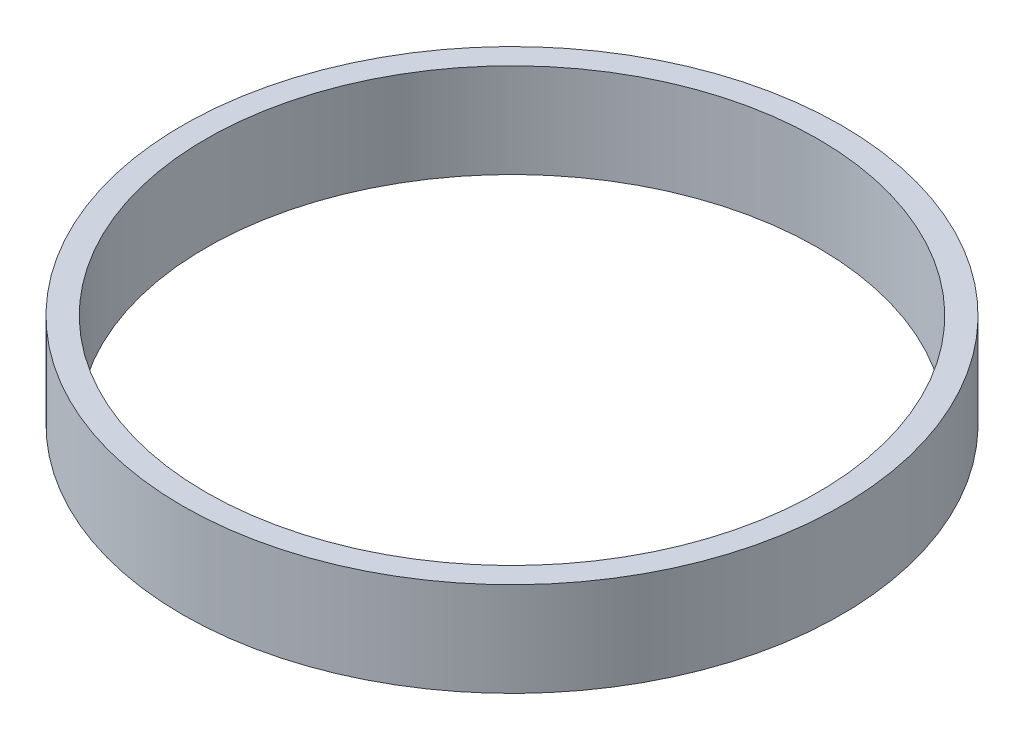
ISO-10303-21;
HEADER;
FILE_DESCRIPTION(('STEP AP214'),'2;1');
FILE_NAME('part.step','',(''),(''),'','','');
FILE_SCHEMA(('AUTOMOTIVE_DESIGN { 1 0 10303 214 1 1 1 1 }'));
ENDSEC;
DATA;
#1=APPLICATION_CONTEXT('core data for automotive mechanical design processes');
#2=APPLICATION_PROTOCOL_DEFINITION('international standard','automotive_design',2000,#1);
#3=PRODUCT_CONTEXT('',#1,'mechanical');
#4=PRODUCT('Part','Part','',(#3));
#5=PRODUCT_RELATED_PRODUCT_CATEGORY('part','',(#4));
#6=PRODUCT_DEFINITION_FORMATION('','',#4);
#7=PRODUCT_DEFINITION_CONTEXT('part definition',#1,'design');
#8=PRODUCT_DEFINITION('design','',#6,#7);
#9=PRODUCT_DEFINITION_SHAPE('','',#8);
#10=(LENGTH_UNIT() NAMED_UNIT(*) SI_UNIT(.MILLI.,.METRE.));
#11=(NAMED_UNIT(*) PLANE_ANGLE_UNIT() SI_UNIT($,.RADIAN.));
#12=(NAMED_UNIT(*) SI_UNIT($,.STERADIAN.) SOLID_ANGLE_UNIT());
#13=UNCERTAINTY_MEASURE_WITH_UNIT(LENGTH_MEASURE(1.E-05),#10,'distance_accuracy_value','');
#14=(GEOMETRIC_REPRESENTATION_CONTEXT(3) GLOBAL_UNCERTAINTY_ASSIGNED_CONTEXT((#13)) GLOBAL_UNIT_ASSIGNED_CONTEXT((#10,
#11,#12)) REPRESENTATION_CONTEXT('',''));
#15=CARTESIAN_POINT('',(0.,0.,0.));
#16=DIRECTION('',(0.,0.,1.));
#17=DIRECTION('',(1.,0.,0.));
#18=AXIS2_PLACEMENT_3D('',#15,#16,#17);
#19=CARTESIAN_POINT('',(0.,10.,0.));
#20=DIRECTION('',(0.,1.,0.));
#21=DIRECTION('',(0.,0.,1.));
#22=AXIS2_PLACEMENT_3D('',#19,#20,#21);
#23=PLANE('',#22);
#24=CARTESIAN_POINT('',(0.,10.,0.));
#25=DIRECTION('',(0.,1.,0.));
#26=DIRECTION('',(0.,0.,1.));
#27=AXIS2_PLACEMENT_3D('',#24,#25,#26);
#28=CIRCLE('',#27,70.);
#29=CARTESIAN_POINT('',(0.,10.,70.));
#30=VERTEX_POINT('',#29);
#31=EDGE_CURVE('E10',#30,#30,#28,.T.);
#32=ORIENTED_EDGE('',*,*,#31,.T.);
#33=EDGE_LOOP('',(#32));
#34=FACE_BOUND('',#33,.T.);
#35=CARTESIAN_POINT('',(0.,10.,0.));
#36=DIRECTION('',(0.,1.,0.));
#37=DIRECTION('',(0.,0.,1.));
#38=AXIS2_PLACEMENT_3D('',#35,#36,#37);
#39=CIRCLE('',#38,65.);
#40=CARTESIAN_POINT('',(0.,10.,65.));
#41=VERTEX_POINT('',#40);
#42=EDGE_CURVE('E56',#41,#41,#39,.T.);
#43=ORIENTED_EDGE('',*,*,#42,.F.);
#44=EDGE_LOOP('',(#43));
#45=FACE_BOUND('',#44,.T.);
#46=ADVANCED_FACE('F43',(#34,#45),#23,.T.);
#47=CARTESIAN_POINT('',(0.,-10.,0.));
#48=DIRECTION('',(0.,1.,0.));
#49=DIRECTION('',(0.,0.,1.));
#50=AXIS2_PLACEMENT_3D('',#47,#48,#49);
#51=PLANE('',#50);
#52=CARTESIAN_POINT('',(0.,-10.,0.));
#53=DIRECTION('',(0.,1.,0.));
#54=DIRECTION('',(0.,0.,1.));
#55=AXIS2_PLACEMENT_3D('',#52,#53,#54);
#56=CIRCLE('',#55,70.);
#57=CARTESIAN_POINT('',(0.,-10.,70.));
#58=VERTEX_POINT('',#57);
#59=EDGE_CURVE('E47',#58,#58,#56,.T.);
#60=ORIENTED_EDGE('',*,*,#59,.F.);
#61=EDGE_LOOP('',(#60));
#62=FACE_BOUND('',#61,.T.);
#63=CARTESIAN_POINT('',(0.,-10.,0.));
#64=DIRECTION('',(0.,1.,0.));
#65=DIRECTION('',(0.,0.,1.));
#66=AXIS2_PLACEMENT_3D('',#63,#64,#65);
#67=CIRCLE('',#66,65.);
#68=CARTESIAN_POINT('',(0.,-10.,65.));
#69=VERTEX_POINT('',#68);
#70=EDGE_CURVE('E58',#69,#69,#67,.T.);
#71=ORIENTED_EDGE('',*,*,#70,.T.);
#72=EDGE_LOOP('',(#71));
#73=FACE_BOUND('',#72,.T.);
#74=ADVANCED_FACE('F70',(#62,#73),#51,.F.);
#75=CARTESIAN_POINT('',(0.,10.,0.));
#76=DIRECTION('',(0.,-1.,0.));
#77=DIRECTION('',(0.,0.,-1.));
#78=AXIS2_PLACEMENT_3D('',#75,#76,#77);
#79=CYLINDRICAL_SURFACE('',#78,70.);
#80=ORIENTED_EDGE('',*,*,#31,.F.);
#81=EDGE_LOOP('',(#80));
#82=FACE_BOUND('',#81,.T.);
#83=ORIENTED_EDGE('',*,*,#59,.T.);
#84=EDGE_LOOP('',(#83));
#85=FACE_BOUND('',#84,.T.);
#86=ADVANCED_FACE('F45',(#82,#85),#79,.T.);
#87=CARTESIAN_POINT('',(0.,10.,0.));
#88=DIRECTION('',(0.,-1.,0.));
#89=DIRECTION('',(0.,0.,-1.));
#90=AXIS2_PLACEMENT_3D('',#87,#88,#89);
#91=CYLINDRICAL_SURFACE('',#90,65.);
#92=ORIENTED_EDGE('',*,*,#42,.T.);
#93=EDGE_LOOP('',(#92));
#94=FACE_BOUND('',#93,.T.);
#95=ORIENTED_EDGE('',*,*,#70,.F.);
#96=EDGE_LOOP('',(#95));
#97=FACE_BOUND('',#96,.T.);
#98=ADVANCED_FACE('F66',(#94,#97),#91,.F.);
#99=CLOSED_SHELL('',(#46,#74,#86,#98));
#100=MANIFOLD_SOLID_BREP('B2',#99);
#101=ADVANCED_BREP_SHAPE_REPRESENTATION('',(#18,#100),#14);
#102=SHAPE_DEFINITION_REPRESENTATION(#9,#101);
ENDSEC;
END-ISO-10303-21;
